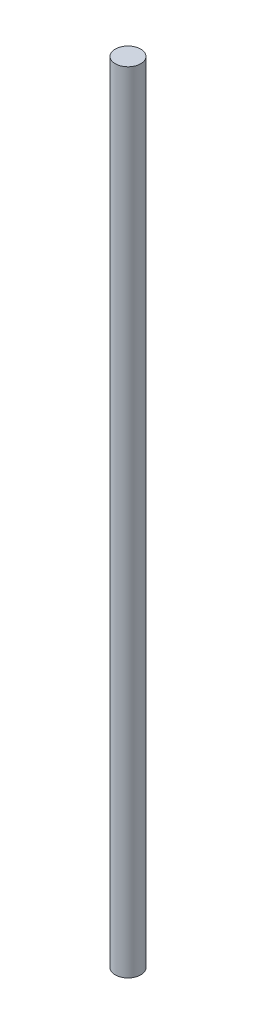
ISO-10303-21;
HEADER;
FILE_DESCRIPTION(('STEP AP214'),'2;1');
FILE_NAME('part.step','',(''),(''),'','','');
FILE_SCHEMA(('AUTOMOTIVE_DESIGN { 1 0 10303 214 1 1 1 1 }'));
ENDSEC;
DATA;
#1=APPLICATION_CONTEXT('core data for automotive mechanical design processes');
#2=APPLICATION_PROTOCOL_DEFINITION('international standard','automotive_design',2000,#1);
#3=PRODUCT_CONTEXT('',#1,'mechanical');
#4=PRODUCT('Part','Part','',(#3));
#5=PRODUCT_RELATED_PRODUCT_CATEGORY('part','',(#4));
#6=PRODUCT_DEFINITION_FORMATION('','',#4);
#7=PRODUCT_DEFINITION_CONTEXT('part definition',#1,'design');
#8=PRODUCT_DEFINITION('design','',#6,#7);
#9=PRODUCT_DEFINITION_SHAPE('','',#8);
#10=(LENGTH_UNIT() NAMED_UNIT(*) SI_UNIT(.MILLI.,.METRE.));
#11=(NAMED_UNIT(*) PLANE_ANGLE_UNIT() SI_UNIT($,.RADIAN.));
#12=(NAMED_UNIT(*) SI_UNIT($,.STERADIAN.) SOLID_ANGLE_UNIT());
#13=UNCERTAINTY_MEASURE_WITH_UNIT(LENGTH_MEASURE(1.E-05),#10,'distance_accuracy_value','');
#14=(GEOMETRIC_REPRESENTATION_CONTEXT(3) GLOBAL_UNCERTAINTY_ASSIGNED_CONTEXT((#13)) GLOBAL_UNIT_ASSIGNED_CONTEXT((#10,
#11,#12)) REPRESENTATION_CONTEXT('',''));
#15=CARTESIAN_POINT('',(0.,0.,0.));
#16=DIRECTION('',(0.,0.,1.));
#17=DIRECTION('',(1.,0.,0.));
#18=AXIS2_PLACEMENT_3D('',#15,#16,#17);
#19=CARTESIAN_POINT('',(0.,196.85,0.));
#20=DIRECTION('',(0.,-1.,0.));
#21=DIRECTION('',(0.,0.,-1.));
#22=AXIS2_PLACEMENT_3D('',#19,#20,#21);
#23=CYLINDRICAL_SURFACE('',#22,3.175);
#24=CARTESIAN_POINT('',(0.,196.85,0.));
#25=DIRECTION('',(0.,1.,0.));
#26=DIRECTION('',(0.,0.,1.));
#27=AXIS2_PLACEMENT_3D('',#24,#25,#26);
#28=CIRCLE('',#27,3.175);
#29=CARTESIAN_POINT('',(0.,196.85,3.175));
#30=VERTEX_POINT('',#29);
#31=EDGE_CURVE('E10',#30,#30,#28,.T.);
#32=ORIENTED_EDGE('',*,*,#31,.F.);
#33=EDGE_LOOP('',(#32));
#34=FACE_BOUND('',#33,.T.);
#35=CARTESIAN_POINT('',(0.,0.,0.));
#36=DIRECTION('',(0.,1.,0.));
#37=DIRECTION('',(0.,0.,1.));
#38=AXIS2_PLACEMENT_3D('',#35,#36,#37);
#39=CIRCLE('',#38,3.175);
#40=CARTESIAN_POINT('',(0.,0.,3.175));
#41=VERTEX_POINT('',#40);
#42=EDGE_CURVE('E35',#41,#41,#39,.T.);
#43=ORIENTED_EDGE('',*,*,#42,.T.);
#44=EDGE_LOOP('',(#43));
#45=FACE_BOUND('',#44,.T.);
#46=ADVANCED_FACE('F32',(#34,#45),#23,.T.);
#47=CARTESIAN_POINT('',(0.,196.85,0.));
#48=DIRECTION('',(0.,1.,0.));
#49=DIRECTION('',(0.,0.,1.));
#50=AXIS2_PLACEMENT_3D('',#47,#48,#49);
#51=PLANE('',#50);
#52=ORIENTED_EDGE('',*,*,#31,.T.);
#53=EDGE_LOOP('',(#52));
#54=FACE_BOUND('',#53,.T.);
#55=ADVANCED_FACE('F47',(#54),#51,.T.);
#56=CARTESIAN_POINT('',(0.,0.,0.));
#57=DIRECTION('',(0.,1.,0.));
#58=DIRECTION('',(0.,0.,1.));
#59=AXIS2_PLACEMENT_3D('',#56,#57,#58);
#60=PLANE('',#59);
#61=ORIENTED_EDGE('',*,*,#42,.F.);
#62=EDGE_LOOP('',(#61));
#63=FACE_BOUND('',#62,.T.);
#64=ADVANCED_FACE('F45',(#63),#60,.F.);
#65=CLOSED_SHELL('',(#46,#55,#64));
#66=MANIFOLD_SOLID_BREP('B2',#65);
#67=ADVANCED_BREP_SHAPE_REPRESENTATION('',(#18,#66),#14);
#68=SHAPE_DEFINITION_REPRESENTATION(#9,#67);
ENDSEC;
END-ISO-10303-21;
